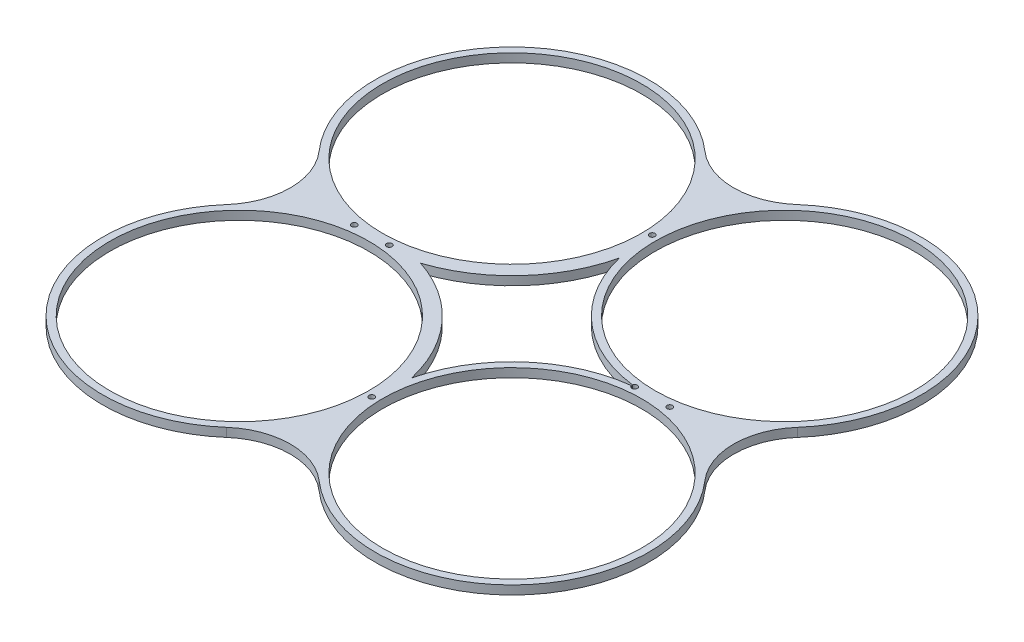
ISO-10303-21;
HEADER;
FILE_DESCRIPTION(('STEP AP214'),'2;1');
FILE_NAME('part.step','',(''),(''),'','','');
FILE_SCHEMA(('AUTOMOTIVE_DESIGN { 1 0 10303 214 1 1 1 1 }'));
ENDSEC;
DATA;
#1=APPLICATION_CONTEXT('core data for automotive mechanical design processes');
#2=APPLICATION_PROTOCOL_DEFINITION('international standard','automotive_design',2000,#1);
#3=PRODUCT_CONTEXT('',#1,'mechanical');
#4=PRODUCT('Part','Part','',(#3));
#5=PRODUCT_RELATED_PRODUCT_CATEGORY('part','',(#4));
#6=PRODUCT_DEFINITION_FORMATION('','',#4);
#7=PRODUCT_DEFINITION_CONTEXT('part definition',#1,'design');
#8=PRODUCT_DEFINITION('design','',#6,#7);
#9=PRODUCT_DEFINITION_SHAPE('','',#8);
#10=(LENGTH_UNIT() NAMED_UNIT(*) SI_UNIT(.MILLI.,.METRE.));
#11=(NAMED_UNIT(*) PLANE_ANGLE_UNIT() SI_UNIT($,.RADIAN.));
#12=(NAMED_UNIT(*) SI_UNIT($,.STERADIAN.) SOLID_ANGLE_UNIT());
#13=UNCERTAINTY_MEASURE_WITH_UNIT(LENGTH_MEASURE(1.E-05),#10,'distance_accuracy_value','');
#14=(GEOMETRIC_REPRESENTATION_CONTEXT(3) GLOBAL_UNCERTAINTY_ASSIGNED_CONTEXT((#13)) GLOBAL_UNIT_ASSIGNED_CONTEXT((#10,
#11,#12)) REPRESENTATION_CONTEXT('',''));
#15=CARTESIAN_POINT('',(0.,0.,0.));
#16=DIRECTION('',(0.,0.,1.));
#17=DIRECTION('',(1.,0.,0.));
#18=AXIS2_PLACEMENT_3D('',#15,#16,#17);
#19=CARTESIAN_POINT('',(70.,5.,0.));
#20=DIRECTION('',(0.,-1.,0.));
#21=DIRECTION('',(0.,0.,-1.));
#22=AXIS2_PLACEMENT_3D('',#19,#20,#21);
#23=CYLINDRICAL_SURFACE('',#22,1.60000000000001);
#24=CARTESIAN_POINT('',(70.,0.,0.));
#25=DIRECTION('',(0.,1.,0.));
#26=DIRECTION('',(0.,0.,1.));
#27=AXIS2_PLACEMENT_3D('',#24,#25,#26);
#28=CIRCLE('',#27,1.60000000000001);
#29=CARTESIAN_POINT('',(71.5997702857477,0.,-0.0271114890448843));
#30=VERTEX_POINT('',#29);
#31=CARTESIAN_POINT('',(68.4373081703196,0.,-0.343502904572385));
#32=VERTEX_POINT('',#31);
#33=EDGE_CURVE('E243',#30,#32,#28,.T.);
#34=ORIENTED_EDGE('',*,*,#33,.F.);
#35=DIRECTION('',(0.,-1.,0.));
#36=VECTOR('',#35,1.);
#37=CARTESIAN_POINT('',(71.5997702857477,5.,-0.0271114890448843));
#38=LINE('',#37,#36);
#39=CARTESIAN_POINT('',(71.5997702857477,5.,-0.0271114890448843));
#40=VERTEX_POINT('',#39);
#41=EDGE_CURVE('E11',#40,#30,#38,.T.);
#42=ORIENTED_EDGE('',*,*,#41,.F.);
#43=CARTESIAN_POINT('',(70.,5.,0.));
#44=DIRECTION('',(0.,1.,0.));
#45=DIRECTION('',(0.,0.,1.));
#46=AXIS2_PLACEMENT_3D('',#43,#44,#45);
#47=CIRCLE('',#46,1.60000000000001);
#48=CARTESIAN_POINT('',(68.4373081703196,5.,-0.343502904572385));
#49=VERTEX_POINT('',#48);
#50=EDGE_CURVE('E297',#40,#49,#47,.T.);
#51=ORIENTED_EDGE('',*,*,#50,.T.);
#52=DIRECTION('',(0.,-1.,0.));
#53=VECTOR('',#52,1.);
#54=CARTESIAN_POINT('',(68.4373081703196,5.,-0.343502904572385));
#55=LINE('',#54,#53);
#56=EDGE_CURVE('E118',#49,#32,#55,.T.);
#57=ORIENTED_EDGE('',*,*,#56,.T.);
#58=EDGE_LOOP('',(#34,#42,#51,#57));
#59=FACE_BOUND('',#58,.T.);
#60=ADVANCED_FACE('F41',(#59),#23,.F.);
#61=CARTESIAN_POINT('',(77.7817459305203,5.,-77.7817459305202));
#62=DIRECTION('',(0.,-1.,0.));
#63=DIRECTION('',(0.,0.,-1.));
#64=AXIS2_PLACEMENT_3D('',#61,#62,#63);
#65=CYLINDRICAL_SURFACE('',#64,78.0000000000001);
#66=CARTESIAN_POINT('',(77.7817459305203,0.,-77.7817459305202));
#67=DIRECTION('',(0.,1.,0.));
#68=DIRECTION('',(0.,0.,1.));
#69=AXIS2_PLACEMENT_3D('',#66,#67,#68);
#70=CIRCLE('',#69,78.0000000000001);
#71=CARTESIAN_POINT('',(71.9507940356715,0.,-1.11022302462516E-13));
#72=VERTEX_POINT('',#71);
#73=EDGE_CURVE('E240',#30,#72,#70,.T.);
#74=ORIENTED_EDGE('',*,*,#73,.T.);
#75=DIRECTION('',(0.,-1.,0.));
#76=VECTOR('',#75,1.);
#77=CARTESIAN_POINT('',(71.9507940356715,5.,-1.11022302462516E-13));
#78=LINE('',#77,#76);
#79=CARTESIAN_POINT('',(71.9507940356715,5.,-1.11022302462516E-13));
#80=VERTEX_POINT('',#79);
#81=EDGE_CURVE('E51',#80,#72,#78,.T.);
#82=ORIENTED_EDGE('',*,*,#81,.F.);
#83=CARTESIAN_POINT('',(77.7817459305203,5.,-77.7817459305202));
#84=DIRECTION('',(0.,1.,0.));
#85=DIRECTION('',(0.,0.,1.));
#86=AXIS2_PLACEMENT_3D('',#83,#84,#85);
#87=CIRCLE('',#86,78.0000000000001);
#88=EDGE_CURVE('E294',#40,#80,#87,.T.);
#89=ORIENTED_EDGE('',*,*,#88,.F.);
#90=ORIENTED_EDGE('',*,*,#41,.T.);
#91=EDGE_LOOP('',(#74,#82,#89,#90));
#92=FACE_BOUND('',#91,.T.);
#93=ADVANCED_FACE('F376',(#92),#65,.T.);
#94=CARTESIAN_POINT('',(77.7817459305203,5.,77.7817459305203));
#95=DIRECTION('',(0.,-1.,0.));
#96=DIRECTION('',(0.,0.,-1.));
#97=AXIS2_PLACEMENT_3D('',#94,#95,#96);
#98=CYLINDRICAL_SURFACE('',#97,78.0000000000002);
#99=CARTESIAN_POINT('',(77.7817459305203,0.,77.7817459305203));
#100=DIRECTION('',(0.,1.,0.));
#101=DIRECTION('',(0.,0.,1.));
#102=AXIS2_PLACEMENT_3D('',#99,#100,#101);
#103=CIRCLE('',#102,78.0000000000002);
#104=CARTESIAN_POINT('',(71.5997702857477,0.,0.0271114890448843));
#105=VERTEX_POINT('',#104);
#106=EDGE_CURVE('E236',#72,#105,#103,.T.);
#107=ORIENTED_EDGE('',*,*,#106,.T.);
#108=DIRECTION('',(0.,-1.,0.));
#109=VECTOR('',#108,1.);
#110=CARTESIAN_POINT('',(71.5997702857477,5.,0.0271114890448843));
#111=LINE('',#110,#109);
#112=CARTESIAN_POINT('',(71.5997702857477,5.,0.0271114890448843));
#113=VERTEX_POINT('',#112);
#114=EDGE_CURVE('E196',#113,#105,#111,.T.);
#115=ORIENTED_EDGE('',*,*,#114,.F.);
#116=CARTESIAN_POINT('',(77.7817459305203,5.,77.7817459305203));
#117=DIRECTION('',(0.,1.,0.));
#118=DIRECTION('',(0.,0.,1.));
#119=AXIS2_PLACEMENT_3D('',#116,#117,#118);
#120=CIRCLE('',#119,78.0000000000002);
#121=EDGE_CURVE('E291',#80,#113,#120,.T.);
#122=ORIENTED_EDGE('',*,*,#121,.F.);
#123=ORIENTED_EDGE('',*,*,#81,.T.);
#124=EDGE_LOOP('',(#107,#115,#122,#123));
#125=FACE_BOUND('',#124,.T.);
#126=ADVANCED_FACE('F382',(#125),#98,.T.);
#127=CARTESIAN_POINT('',(68.4373081703196,0.,0.343502904572385));
#128=VERTEX_POINT('',#127);
#129=EDGE_CURVE('E239',#128,#105,#28,.T.);
#130=ORIENTED_EDGE('',*,*,#129,.F.);
#131=DIRECTION('',(0.,-1.,0.));
#132=VECTOR('',#131,1.);
#133=CARTESIAN_POINT('',(68.4373081703196,5.,0.343502904572385));
#134=LINE('',#133,#132);
#135=CARTESIAN_POINT('',(68.4373081703196,5.,0.343502904572385));
#136=VERTEX_POINT('',#135);
#137=EDGE_CURVE('E190',#136,#128,#134,.T.);
#138=ORIENTED_EDGE('',*,*,#137,.F.);
#139=EDGE_CURVE('E293',#136,#113,#47,.T.);
#140=ORIENTED_EDGE('',*,*,#139,.T.);
#141=ORIENTED_EDGE('',*,*,#114,.T.);
#142=EDGE_LOOP('',(#130,#138,#140,#141));
#143=FACE_BOUND('',#142,.T.);
#144=ADVANCED_FACE('F378',(#143),#23,.F.);
#145=CARTESIAN_POINT('',(2.0043584537079,0.,59.2942488801065));
#146=VERTEX_POINT('',#145);
#147=EDGE_CURVE('E235',#128,#146,#103,.T.);
#148=ORIENTED_EDGE('',*,*,#147,.T.);
#149=DIRECTION('',(0.,-1.,0.));
#150=VECTOR('',#149,1.);
#151=CARTESIAN_POINT('',(2.0043584537079,5.,59.2942488801065));
#152=LINE('',#151,#150);
#153=CARTESIAN_POINT('',(2.0043584537079,5.,59.2942488801065));
#154=VERTEX_POINT('',#153);
#155=EDGE_CURVE('E188',#154,#146,#152,.T.);
#156=ORIENTED_EDGE('',*,*,#155,.F.);
#157=EDGE_CURVE('E181',#136,#154,#120,.T.);
#158=ORIENTED_EDGE('',*,*,#157,.F.);
#159=ORIENTED_EDGE('',*,*,#137,.T.);
#160=EDGE_LOOP('',(#148,#156,#158,#159));
#161=FACE_BOUND('',#160,.T.);
#162=ADVANCED_FACE('F389',(#161),#98,.T.);
#163=CARTESIAN_POINT('',(-77.7817459305202,5.,77.7817459305203));
#164=DIRECTION('',(0.,-1.,0.));
#165=DIRECTION('',(0.,0.,-1.));
#166=AXIS2_PLACEMENT_3D('',#163,#164,#165);
#167=CYLINDRICAL_SURFACE('',#166,81.9);
#168=CARTESIAN_POINT('',(-77.7817459305202,0.,77.7817459305203));
#169=DIRECTION('',(0.,1.,0.));
#170=DIRECTION('',(0.,0.,1.));
#171=AXIS2_PLACEMENT_3D('',#168,#169,#170);
#172=CIRCLE('',#171,81.9);
#173=CARTESIAN_POINT('',(-52.1378382719749,0.,0.));
#174=VERTEX_POINT('',#173);
#175=EDGE_CURVE('E187',#146,#174,#172,.T.);
#176=ORIENTED_EDGE('',*,*,#175,.T.);
#177=DIRECTION('',(0.,-1.,0.));
#178=VECTOR('',#177,1.);
#179=CARTESIAN_POINT('',(-52.1378382719749,5.,0.));
#180=LINE('',#179,#178);
#181=CARTESIAN_POINT('',(-52.1378382719749,5.,0.));
#182=VERTEX_POINT('',#181);
#183=EDGE_CURVE('E171',#182,#174,#180,.T.);
#184=ORIENTED_EDGE('',*,*,#183,.F.);
#185=CARTESIAN_POINT('',(-77.7817459305202,5.,77.7817459305203));
#186=DIRECTION('',(0.,1.,0.));
#187=DIRECTION('',(0.,0.,1.));
#188=AXIS2_PLACEMENT_3D('',#185,#186,#187);
#189=CIRCLE('',#188,81.9);
#190=EDGE_CURVE('E174',#154,#182,#189,.T.);
#191=ORIENTED_EDGE('',*,*,#190,.F.);
#192=ORIENTED_EDGE('',*,*,#155,.T.);
#193=EDGE_LOOP('',(#176,#184,#191,#192));
#194=FACE_BOUND('',#193,.T.);
#195=ADVANCED_FACE('F186',(#194),#167,.T.);
#196=CARTESIAN_POINT('',(-77.7817459305202,5.,-77.7817459305202));
#197=DIRECTION('',(0.,-1.,0.));
#198=DIRECTION('',(0.,0.,-1.));
#199=AXIS2_PLACEMENT_3D('',#196,#197,#198);
#200=CYLINDRICAL_SURFACE('',#199,81.8999999999999);
#201=CARTESIAN_POINT('',(-77.7817459305202,0.,-77.7817459305202));
#202=DIRECTION('',(0.,1.,0.));
#203=DIRECTION('',(0.,0.,1.));
#204=AXIS2_PLACEMENT_3D('',#201,#202,#203);
#205=CIRCLE('',#204,81.8999999999999);
#206=CARTESIAN_POINT('',(2.00435845370781,0.,-59.2942488801068));
#207=VERTEX_POINT('',#206);
#208=EDGE_CURVE('E232',#174,#207,#205,.T.);
#209=ORIENTED_EDGE('',*,*,#208,.T.);
#210=DIRECTION('',(0.,-1.,0.));
#211=VECTOR('',#210,1.);
#212=CARTESIAN_POINT('',(2.00435845370781,5.,-59.2942488801068));
#213=LINE('',#212,#211);
#214=CARTESIAN_POINT('',(2.00435845370781,5.,-59.2942488801068));
#215=VERTEX_POINT('',#214);
#216=EDGE_CURVE('E173',#215,#207,#213,.T.);
#217=ORIENTED_EDGE('',*,*,#216,.F.);
#218=CARTESIAN_POINT('',(-77.7817459305202,5.,-77.7817459305202));
#219=DIRECTION('',(0.,1.,0.));
#220=DIRECTION('',(0.,0.,1.));
#221=AXIS2_PLACEMENT_3D('',#218,#219,#220);
#222=CIRCLE('',#221,81.8999999999999);
#223=EDGE_CURVE('E166',#182,#215,#222,.T.);
#224=ORIENTED_EDGE('',*,*,#223,.F.);
#225=ORIENTED_EDGE('',*,*,#183,.T.);
#226=EDGE_LOOP('',(#209,#217,#224,#225));
#227=FACE_BOUND('',#226,.T.);
#228=ADVANCED_FACE('F169',(#227),#200,.T.);
#229=CARTESIAN_POINT('',(-166.517308136436,5.,0.));
#230=DIRECTION('',(0.,-1.,0.));
#231=DIRECTION('',(0.,0.,-1.));
#232=AXIS2_PLACEMENT_3D('',#229,#230,#231);
#233=CYLINDRICAL_SURFACE('',#232,40.);
#234=CARTESIAN_POINT('',(-166.517308136436,0.,0.));
#235=DIRECTION('',(0.,1.,0.));
#236=DIRECTION('',(0.,0.,1.));
#237=AXIS2_PLACEMENT_3D('',#234,#235,#236);
#238=CIRCLE('',#237,40.);
#239=CARTESIAN_POINT('',(-136.437456541211,0.,-26.3666935357696));
#240=VERTEX_POINT('',#239);
#241=CARTESIAN_POINT('',(-136.437456541211,0.,26.3666935357696));
#242=VERTEX_POINT('',#241);
#243=EDGE_CURVE('E275',#240,#242,#238,.F.);
#244=ORIENTED_EDGE('',*,*,#243,.T.);
#245=DIRECTION('',(0.,-1.,0.));
#246=VECTOR('',#245,1.);
#247=CARTESIAN_POINT('',(-136.437456541211,5.,26.3666935357696));
#248=LINE('',#247,#246);
#249=CARTESIAN_POINT('',(-136.437456541211,5.,26.3666935357696));
#250=VERTEX_POINT('',#249);
#251=EDGE_CURVE('E45',#250,#242,#248,.T.);
#252=ORIENTED_EDGE('',*,*,#251,.F.);
#253=CARTESIAN_POINT('',(-166.517308136436,5.,0.));
#254=DIRECTION('',(0.,1.,0.));
#255=DIRECTION('',(0.,0.,1.));
#256=AXIS2_PLACEMENT_3D('',#253,#254,#255);
#257=CIRCLE('',#256,40.);
#258=CARTESIAN_POINT('',(-136.437456541211,5.,-26.3666935357696));
#259=VERTEX_POINT('',#258);
#260=EDGE_CURVE('E326',#259,#250,#257,.F.);
#261=ORIENTED_EDGE('',*,*,#260,.F.);
#262=DIRECTION('',(0.,-1.,0.));
#263=VECTOR('',#262,1.);
#264=CARTESIAN_POINT('',(-136.437456541211,5.,-26.3666935357696));
#265=LINE('',#264,#263);
#266=EDGE_CURVE('E200',#259,#240,#265,.T.);
#267=ORIENTED_EDGE('',*,*,#266,.T.);
#268=EDGE_LOOP('',(#244,#252,#261,#267));
#269=FACE_BOUND('',#268,.T.);
#270=ADVANCED_FACE('F411',(#269),#233,.F.);
#271=CARTESIAN_POINT('',(-77.7817459305202,5.,77.7817459305203));
#272=DIRECTION('',(0.,-1.,0.));
#273=DIRECTION('',(0.,0.,-1.));
#274=AXIS2_PLACEMENT_3D('',#271,#272,#273);
#275=CYLINDRICAL_SURFACE('',#274,78.);
#276=CARTESIAN_POINT('',(-77.7817459305202,0.,77.7817459305203));
#277=DIRECTION('',(0.,1.,0.));
#278=DIRECTION('',(0.,0.,1.));
#279=AXIS2_PLACEMENT_3D('',#276,#277,#278);
#280=CIRCLE('',#279,78.);
#281=CARTESIAN_POINT('',(-26.3666935357695,0.,136.43745654121));
#282=VERTEX_POINT('',#281);
#283=EDGE_CURVE('E273',#242,#282,#280,.T.);
#284=ORIENTED_EDGE('',*,*,#283,.T.);
#285=DIRECTION('',(0.,-1.,0.));
#286=VECTOR('',#285,1.);
#287=CARTESIAN_POINT('',(-26.3666935357695,5.,136.43745654121));
#288=LINE('',#287,#286);
#289=CARTESIAN_POINT('',(-26.3666935357695,5.,136.43745654121));
#290=VERTEX_POINT('',#289);
#291=EDGE_CURVE('E214',#290,#282,#288,.T.);
#292=ORIENTED_EDGE('',*,*,#291,.F.);
#293=CARTESIAN_POINT('',(-77.7817459305202,5.,77.7817459305203));
#294=DIRECTION('',(0.,1.,0.));
#295=DIRECTION('',(0.,0.,1.));
#296=AXIS2_PLACEMENT_3D('',#293,#294,#295);
#297=CIRCLE('',#296,78.);
#298=EDGE_CURVE('E126',#250,#290,#297,.T.);
#299=ORIENTED_EDGE('',*,*,#298,.F.);
#300=ORIENTED_EDGE('',*,*,#251,.T.);
#301=EDGE_LOOP('',(#284,#292,#299,#300));
#302=FACE_BOUND('',#301,.T.);
#303=ADVANCED_FACE('F454',(#302),#275,.T.);
#304=CARTESIAN_POINT('',(0.,5.,166.517308136436));
#305=DIRECTION('',(0.,-1.,0.));
#306=DIRECTION('',(0.,0.,-1.));
#307=AXIS2_PLACEMENT_3D('',#304,#305,#306);
#308=CYLINDRICAL_SURFACE('',#307,40.);
#309=CARTESIAN_POINT('',(0.,0.,166.517308136436));
#310=DIRECTION('',(0.,1.,0.));
#311=DIRECTION('',(0.,0.,1.));
#312=AXIS2_PLACEMENT_3D('',#309,#310,#311);
#313=CIRCLE('',#312,40.);
#314=CARTESIAN_POINT('',(26.3666935357696,0.,136.43745654121));
#315=VERTEX_POINT('',#314);
#316=EDGE_CURVE('E271',#282,#315,#313,.F.);
#317=ORIENTED_EDGE('',*,*,#316,.T.);
#318=DIRECTION('',(0.,-1.,0.));
#319=VECTOR('',#318,1.);
#320=CARTESIAN_POINT('',(26.3666935357696,5.,136.43745654121));
#321=LINE('',#320,#319);
#322=CARTESIAN_POINT('',(26.3666935357696,5.,136.43745654121));
#323=VERTEX_POINT('',#322);
#324=EDGE_CURVE('E212',#323,#315,#321,.T.);
#325=ORIENTED_EDGE('',*,*,#324,.F.);
#326=CARTESIAN_POINT('',(0.,5.,166.517308136436));
#327=DIRECTION('',(0.,1.,0.));
#328=DIRECTION('',(0.,0.,1.));
#329=AXIS2_PLACEMENT_3D('',#326,#327,#328);
#330=CIRCLE('',#329,40.);
#331=EDGE_CURVE('E323',#290,#323,#330,.F.);
#332=ORIENTED_EDGE('',*,*,#331,.F.);
#333=ORIENTED_EDGE('',*,*,#291,.T.);
#334=EDGE_LOOP('',(#317,#325,#332,#333));
#335=FACE_BOUND('',#334,.T.);
#336=ADVANCED_FACE('F450',(#335),#308,.F.);
#337=CARTESIAN_POINT('',(77.7817459305203,5.,77.7817459305203));
#338=DIRECTION('',(0.,-1.,0.));
#339=DIRECTION('',(0.,0.,-1.));
#340=AXIS2_PLACEMENT_3D('',#337,#338,#339);
#341=CYLINDRICAL_SURFACE('',#340,77.9999999999999);
#342=CARTESIAN_POINT('',(77.7817459305203,0.,77.7817459305203));
#343=DIRECTION('',(0.,1.,0.));
#344=DIRECTION('',(0.,0.,1.));
#345=AXIS2_PLACEMENT_3D('',#342,#343,#344);
#346=CIRCLE('',#345,77.9999999999999);
#347=CARTESIAN_POINT('',(136.437456541211,0.,26.3666935357697));
#348=VERTEX_POINT('',#347);
#349=EDGE_CURVE('E268',#315,#348,#346,.T.);
#350=ORIENTED_EDGE('',*,*,#349,.T.);
#351=DIRECTION('',(0.,-1.,0.));
#352=VECTOR('',#351,1.);
#353=CARTESIAN_POINT('',(136.437456541211,5.,26.3666935357697));
#354=LINE('',#353,#352);
#355=CARTESIAN_POINT('',(136.437456541211,5.,26.3666935357697));
#356=VERTEX_POINT('',#355);
#357=EDGE_CURVE('E210',#356,#348,#354,.T.);
#358=ORIENTED_EDGE('',*,*,#357,.F.);
#359=CARTESIAN_POINT('',(77.7817459305203,5.,77.7817459305203));
#360=DIRECTION('',(0.,1.,0.));
#361=DIRECTION('',(0.,0.,1.));
#362=AXIS2_PLACEMENT_3D('',#359,#360,#361);
#363=CIRCLE('',#362,77.9999999999999);
#364=EDGE_CURVE('E321',#323,#356,#363,.T.);
#365=ORIENTED_EDGE('',*,*,#364,.F.);
#366=ORIENTED_EDGE('',*,*,#324,.T.);
#367=EDGE_LOOP('',(#350,#358,#365,#366));
#368=FACE_BOUND('',#367,.T.);
#369=ADVANCED_FACE('F446',(#368),#341,.T.);
#370=CARTESIAN_POINT('',(166.517308136436,5.,0.));
#371=DIRECTION('',(0.,-1.,0.));
#372=DIRECTION('',(0.,0.,-1.));
#373=AXIS2_PLACEMENT_3D('',#370,#371,#372);
#374=CYLINDRICAL_SURFACE('',#373,40.);
#375=CARTESIAN_POINT('',(166.517308136436,0.,0.));
#376=DIRECTION('',(0.,1.,0.));
#377=DIRECTION('',(0.,0.,1.));
#378=AXIS2_PLACEMENT_3D('',#375,#376,#377);
#379=CIRCLE('',#378,40.);
#380=CARTESIAN_POINT('',(136.437456541211,0.,-26.3666935357696));
#381=VERTEX_POINT('',#380);
#382=EDGE_CURVE('E265',#381,#348,#379,.T.);
#383=ORIENTED_EDGE('',*,*,#382,.F.);
#384=DIRECTION('',(0.,-1.,0.));
#385=VECTOR('',#384,1.);
#386=CARTESIAN_POINT('',(136.437456541211,5.,-26.3666935357696));
#387=LINE('',#386,#385);
#388=CARTESIAN_POINT('',(136.437456541211,5.,-26.3666935357696));
#389=VERTEX_POINT('',#388);
#390=EDGE_CURVE('E208',#389,#381,#387,.T.);
#391=ORIENTED_EDGE('',*,*,#390,.F.);
#392=CARTESIAN_POINT('',(166.517308136436,5.,0.));
#393=DIRECTION('',(0.,1.,0.));
#394=DIRECTION('',(0.,0.,1.));
#395=AXIS2_PLACEMENT_3D('',#392,#393,#394);
#396=CIRCLE('',#395,40.);
#397=EDGE_CURVE('E318',#389,#356,#396,.T.);
#398=ORIENTED_EDGE('',*,*,#397,.T.);
#399=ORIENTED_EDGE('',*,*,#357,.T.);
#400=EDGE_LOOP('',(#383,#391,#398,#399));
#401=FACE_BOUND('',#400,.T.);
#402=ADVANCED_FACE('F436',(#401),#374,.F.);
#403=CARTESIAN_POINT('',(77.7817459305203,5.,-77.7817459305202));
#404=DIRECTION('',(0.,-1.,0.));
#405=DIRECTION('',(0.,0.,-1.));
#406=AXIS2_PLACEMENT_3D('',#403,#404,#405);
#407=CYLINDRICAL_SURFACE('',#406,78.);
#408=CARTESIAN_POINT('',(77.7817459305203,0.,-77.7817459305202));
#409=DIRECTION('',(0.,1.,0.));
#410=DIRECTION('',(0.,0.,1.));
#411=AXIS2_PLACEMENT_3D('',#408,#409,#410);
#412=CIRCLE('',#411,78.);
#413=CARTESIAN_POINT('',(26.3666935357696,0.,-136.43745654121));
#414=VERTEX_POINT('',#413);
#415=EDGE_CURVE('E262',#381,#414,#412,.T.);
#416=ORIENTED_EDGE('',*,*,#415,.T.);
#417=DIRECTION('',(0.,-1.,0.));
#418=VECTOR('',#417,1.);
#419=CARTESIAN_POINT('',(26.3666935357696,5.,-136.43745654121));
#420=LINE('',#419,#418);
#421=CARTESIAN_POINT('',(26.3666935357696,5.,-136.43745654121));
#422=VERTEX_POINT('',#421);
#423=EDGE_CURVE('E206',#422,#414,#420,.T.);
#424=ORIENTED_EDGE('',*,*,#423,.F.);
#425=CARTESIAN_POINT('',(77.7817459305203,5.,-77.7817459305202));
#426=DIRECTION('',(0.,1.,0.));
#427=DIRECTION('',(0.,0.,1.));
#428=AXIS2_PLACEMENT_3D('',#425,#426,#427);
#429=CIRCLE('',#428,78.);
#430=EDGE_CURVE('E316',#389,#422,#429,.T.);
#431=ORIENTED_EDGE('',*,*,#430,.F.);
#432=ORIENTED_EDGE('',*,*,#390,.T.);
#433=EDGE_LOOP('',(#416,#424,#431,#432));
#434=FACE_BOUND('',#433,.T.);
#435=ADVANCED_FACE('F426',(#434),#407,.T.);
#436=CARTESIAN_POINT('',(0.,5.,-166.517308136436));
#437=DIRECTION('',(0.,-1.,0.));
#438=DIRECTION('',(0.,0.,-1.));
#439=AXIS2_PLACEMENT_3D('',#436,#437,#438);
#440=CYLINDRICAL_SURFACE('',#439,40.);
#441=CARTESIAN_POINT('',(0.,0.,-166.517308136436));
#442=DIRECTION('',(0.,1.,0.));
#443=DIRECTION('',(0.,0.,1.));
#444=AXIS2_PLACEMENT_3D('',#441,#442,#443);
#445=CIRCLE('',#444,40.);
#446=CARTESIAN_POINT('',(-26.3666935357695,0.,-136.43745654121));
#447=VERTEX_POINT('',#446);
#448=EDGE_CURVE('E259',#447,#414,#445,.T.);
#449=ORIENTED_EDGE('',*,*,#448,.F.);
#450=DIRECTION('',(0.,-1.,0.));
#451=VECTOR('',#450,1.);
#452=CARTESIAN_POINT('',(-26.3666935357695,5.,-136.43745654121));
#453=LINE('',#452,#451);
#454=CARTESIAN_POINT('',(-26.3666935357695,5.,-136.43745654121));
#455=VERTEX_POINT('',#454);
#456=EDGE_CURVE('E203',#455,#447,#453,.T.);
#457=ORIENTED_EDGE('',*,*,#456,.F.);
#458=CARTESIAN_POINT('',(0.,5.,-166.517308136436));
#459=DIRECTION('',(0.,1.,0.));
#460=DIRECTION('',(0.,0.,1.));
#461=AXIS2_PLACEMENT_3D('',#458,#459,#460);
#462=CIRCLE('',#461,40.);
#463=EDGE_CURVE('E313',#455,#422,#462,.T.);
#464=ORIENTED_EDGE('',*,*,#463,.T.);
#465=ORIENTED_EDGE('',*,*,#423,.T.);
#466=EDGE_LOOP('',(#449,#457,#464,#465));
#467=FACE_BOUND('',#466,.T.);
#468=ADVANCED_FACE('F421',(#467),#440,.F.);
#469=CARTESIAN_POINT('',(0.,5.,80.));
#470=DIRECTION('',(0.,-1.,0.));
#471=DIRECTION('',(0.,0.,-1.));
#472=AXIS2_PLACEMENT_3D('',#469,#470,#471);
#473=CYLINDRICAL_SURFACE('',#472,1.6);
#474=CARTESIAN_POINT('',(0.,5.,80.));
#475=DIRECTION('',(0.,1.,0.));
#476=DIRECTION('',(0.,0.,1.));
#477=AXIS2_PLACEMENT_3D('',#474,#475,#476);
#478=CIRCLE('',#477,1.6);
#479=CARTESIAN_POINT('',(0.,5.,81.6));
#480=VERTEX_POINT('',#479);
#481=EDGE_CURVE('E285',#480,#480,#478,.T.);
#482=ORIENTED_EDGE('',*,*,#481,.T.);
#483=EDGE_LOOP('',(#482));
#484=FACE_BOUND('',#483,.T.);
#485=CARTESIAN_POINT('',(0.,0.,80.));
#486=DIRECTION('',(0.,1.,0.));
#487=DIRECTION('',(0.,0.,1.));
#488=AXIS2_PLACEMENT_3D('',#485,#486,#487);
#489=CIRCLE('',#488,1.6);
#490=CARTESIAN_POINT('',(0.,0.,81.6));
#491=VERTEX_POINT('',#490);
#492=EDGE_CURVE('E226',#491,#491,#489,.T.);
#493=ORIENTED_EDGE('',*,*,#492,.F.);
#494=EDGE_LOOP('',(#493));
#495=FACE_BOUND('',#494,.T.);
#496=ADVANCED_FACE('F418',(#484,#495),#473,.F.);
#497=CARTESIAN_POINT('',(-70.,5.,0.));
#498=DIRECTION('',(0.,-1.,0.));
#499=DIRECTION('',(0.,0.,-1.));
#500=AXIS2_PLACEMENT_3D('',#497,#498,#499);
#501=CYLINDRICAL_SURFACE('',#500,1.60000000000001);
#502=CARTESIAN_POINT('',(-70.,5.,0.));
#503=DIRECTION('',(0.,1.,0.));
#504=DIRECTION('',(0.,0.,1.));
#505=AXIS2_PLACEMENT_3D('',#502,#503,#504);
#506=CIRCLE('',#505,1.60000000000001);
#507=CARTESIAN_POINT('',(-70.,5.,1.60000000000001));
#508=VERTEX_POINT('',#507);
#509=EDGE_CURVE('E288',#508,#508,#506,.F.);
#510=ORIENTED_EDGE('',*,*,#509,.F.);
#511=EDGE_LOOP('',(#510));
#512=FACE_BOUND('',#511,.T.);
#513=CARTESIAN_POINT('',(-70.,0.,0.));
#514=DIRECTION('',(0.,1.,0.));
#515=DIRECTION('',(0.,0.,1.));
#516=AXIS2_PLACEMENT_3D('',#513,#514,#515);
#517=CIRCLE('',#516,1.60000000000001);
#518=CARTESIAN_POINT('',(-70.,0.,1.60000000000001));
#519=VERTEX_POINT('',#518);
#520=EDGE_CURVE('E229',#519,#519,#517,.F.);
#521=ORIENTED_EDGE('',*,*,#520,.T.);
#522=EDGE_LOOP('',(#521));
#523=FACE_BOUND('',#522,.T.);
#524=ADVANCED_FACE('F415',(#512,#523),#501,.F.);
#525=EDGE_CURVE('E111',#207,#32,#70,.T.);
#526=ORIENTED_EDGE('',*,*,#525,.T.);
#527=ORIENTED_EDGE('',*,*,#56,.F.);
#528=EDGE_CURVE('E60',#215,#49,#87,.T.);
#529=ORIENTED_EDGE('',*,*,#528,.F.);
#530=ORIENTED_EDGE('',*,*,#216,.T.);
#531=EDGE_LOOP('',(#526,#527,#529,#530));
#532=FACE_BOUND('',#531,.T.);
#533=ADVANCED_FACE('F385',(#532),#65,.T.);
#534=CARTESIAN_POINT('',(77.7817459305203,5.,-77.7817459305202));
#535=DIRECTION('',(0.,-1.,0.));
#536=DIRECTION('',(0.,0.,-1.));
#537=AXIS2_PLACEMENT_3D('',#534,#535,#536);
#538=CYLINDRICAL_SURFACE('',#537,73.9);
#539=CARTESIAN_POINT('',(77.7817459305203,5.,-77.7817459305202));
#540=DIRECTION('',(0.,1.,0.));
#541=DIRECTION('',(0.,0.,1.));
#542=AXIS2_PLACEMENT_3D('',#539,#540,#541);
#543=CIRCLE('',#542,73.9);
#544=CARTESIAN_POINT('',(77.7817459305203,5.,-3.88174593052021));
#545=VERTEX_POINT('',#544);
#546=EDGE_CURVE('E299',#545,#545,#543,.T.);
#547=ORIENTED_EDGE('',*,*,#546,.T.);
#548=EDGE_LOOP('',(#547));
#549=FACE_BOUND('',#548,.T.);
#550=CARTESIAN_POINT('',(77.7817459305203,0.,-77.7817459305202));
#551=DIRECTION('',(0.,1.,0.));
#552=DIRECTION('',(0.,0.,1.));
#553=AXIS2_PLACEMENT_3D('',#550,#551,#552);
#554=CIRCLE('',#553,73.9);
#555=CARTESIAN_POINT('',(77.7817459305203,0.,-3.88174593052021));
#556=VERTEX_POINT('',#555);
#557=EDGE_CURVE('E245',#556,#556,#554,.T.);
#558=ORIENTED_EDGE('',*,*,#557,.F.);
#559=EDGE_LOOP('',(#558));
#560=FACE_BOUND('',#559,.T.);
#561=ADVANCED_FACE('F414',(#549,#560),#538,.F.);
#562=CARTESIAN_POINT('',(-77.7817459305202,5.,-77.7817459305202));
#563=DIRECTION('',(0.,-1.,0.));
#564=DIRECTION('',(0.,0.,-1.));
#565=AXIS2_PLACEMENT_3D('',#562,#563,#564);
#566=CYLINDRICAL_SURFACE('',#565,73.9);
#567=CARTESIAN_POINT('',(-77.7817459305202,5.,-77.7817459305202));
#568=DIRECTION('',(0.,1.,0.));
#569=DIRECTION('',(0.,0.,1.));
#570=AXIS2_PLACEMENT_3D('',#567,#568,#569);
#571=CIRCLE('',#570,73.9);
#572=CARTESIAN_POINT('',(-77.7817459305202,5.,-3.88174593052021));
#573=VERTEX_POINT('',#572);
#574=EDGE_CURVE('E302',#573,#573,#571,.T.);
#575=ORIENTED_EDGE('',*,*,#574,.T.);
#576=EDGE_LOOP('',(#575));
#577=FACE_BOUND('',#576,.T.);
#578=CARTESIAN_POINT('',(-77.7817459305202,0.,-77.7817459305202));
#579=DIRECTION('',(0.,1.,0.));
#580=DIRECTION('',(0.,0.,1.));
#581=AXIS2_PLACEMENT_3D('',#578,#579,#580);
#582=CIRCLE('',#581,73.9);
#583=CARTESIAN_POINT('',(-77.7817459305202,0.,-3.88174593052021));
#584=VERTEX_POINT('',#583);
#585=EDGE_CURVE('E248',#584,#584,#582,.T.);
#586=ORIENTED_EDGE('',*,*,#585,.F.);
#587=EDGE_LOOP('',(#586));
#588=FACE_BOUND('',#587,.T.);
#589=ADVANCED_FACE('F481',(#577,#588),#566,.F.);
#590=CARTESIAN_POINT('',(-77.7817459305202,5.,77.7817459305203));
#591=DIRECTION('',(0.,-1.,0.));
#592=DIRECTION('',(0.,0.,-1.));
#593=AXIS2_PLACEMENT_3D('',#590,#591,#592);
#594=CYLINDRICAL_SURFACE('',#593,73.9);
#595=CARTESIAN_POINT('',(-77.7817459305202,5.,77.7817459305203));
#596=DIRECTION('',(0.,1.,0.));
#597=DIRECTION('',(0.,0.,1.));
#598=AXIS2_PLACEMENT_3D('',#595,#596,#597);
#599=CIRCLE('',#598,73.9);
#600=CARTESIAN_POINT('',(-77.7817459305202,5.,151.68174593052));
#601=VERTEX_POINT('',#600);
#602=EDGE_CURVE('E305',#601,#601,#599,.T.);
#603=ORIENTED_EDGE('',*,*,#602,.T.);
#604=EDGE_LOOP('',(#603));
#605=FACE_BOUND('',#604,.T.);
#606=CARTESIAN_POINT('',(-77.7817459305202,0.,77.7817459305203));
#607=DIRECTION('',(0.,1.,0.));
#608=DIRECTION('',(0.,0.,1.));
#609=AXIS2_PLACEMENT_3D('',#606,#607,#608);
#610=CIRCLE('',#609,73.9);
#611=CARTESIAN_POINT('',(-77.7817459305202,0.,151.68174593052));
#612=VERTEX_POINT('',#611);
#613=EDGE_CURVE('E251',#612,#612,#610,.T.);
#614=ORIENTED_EDGE('',*,*,#613,.F.);
#615=EDGE_LOOP('',(#614));
#616=FACE_BOUND('',#615,.T.);
#617=ADVANCED_FACE('F485',(#605,#616),#594,.F.);
#618=CARTESIAN_POINT('',(77.7817459305203,5.,77.7817459305203));
#619=DIRECTION('',(0.,-1.,0.));
#620=DIRECTION('',(0.,0.,-1.));
#621=AXIS2_PLACEMENT_3D('',#618,#619,#620);
#622=CYLINDRICAL_SURFACE('',#621,73.9);
#623=CARTESIAN_POINT('',(77.7817459305203,5.,77.7817459305203));
#624=DIRECTION('',(0.,1.,0.));
#625=DIRECTION('',(0.,0.,1.));
#626=AXIS2_PLACEMENT_3D('',#623,#624,#625);
#627=CIRCLE('',#626,73.9);
#628=CARTESIAN_POINT('',(77.7817459305203,5.,151.68174593052));
#629=VERTEX_POINT('',#628);
#630=EDGE_CURVE('E308',#629,#629,#627,.T.);
#631=ORIENTED_EDGE('',*,*,#630,.T.);
#632=EDGE_LOOP('',(#631));
#633=FACE_BOUND('',#632,.T.);
#634=CARTESIAN_POINT('',(77.7817459305203,0.,77.7817459305203));
#635=DIRECTION('',(0.,1.,0.));
#636=DIRECTION('',(0.,0.,1.));
#637=AXIS2_PLACEMENT_3D('',#634,#635,#636);
#638=CIRCLE('',#637,73.9);
#639=CARTESIAN_POINT('',(77.7817459305203,0.,151.68174593052));
#640=VERTEX_POINT('',#639);
#641=EDGE_CURVE('E254',#640,#640,#638,.T.);
#642=ORIENTED_EDGE('',*,*,#641,.F.);
#643=EDGE_LOOP('',(#642));
#644=FACE_BOUND('',#643,.T.);
#645=ADVANCED_FACE('F464',(#633,#644),#622,.F.);
#646=CARTESIAN_POINT('',(-77.7817459305202,5.,-77.7817459305202));
#647=DIRECTION('',(0.,-1.,0.));
#648=DIRECTION('',(0.,0.,-1.));
#649=AXIS2_PLACEMENT_3D('',#646,#647,#648);
#650=CYLINDRICAL_SURFACE('',#649,78.);
#651=CARTESIAN_POINT('',(-77.7817459305202,0.,-77.7817459305202));
#652=DIRECTION('',(0.,1.,0.));
#653=DIRECTION('',(0.,0.,1.));
#654=AXIS2_PLACEMENT_3D('',#651,#652,#653);
#655=CIRCLE('',#654,78.);
#656=EDGE_CURVE('E257',#447,#240,#655,.T.);
#657=ORIENTED_EDGE('',*,*,#656,.T.);
#658=ORIENTED_EDGE('',*,*,#266,.F.);
#659=CARTESIAN_POINT('',(-77.7817459305202,5.,-77.7817459305202));
#660=DIRECTION('',(0.,1.,0.));
#661=DIRECTION('',(0.,0.,1.));
#662=AXIS2_PLACEMENT_3D('',#659,#660,#661);
#663=CIRCLE('',#662,78.);
#664=EDGE_CURVE('E311',#455,#259,#663,.T.);
#665=ORIENTED_EDGE('',*,*,#664,.F.);
#666=ORIENTED_EDGE('',*,*,#456,.T.);
#667=EDGE_LOOP('',(#657,#658,#665,#666));
#668=FACE_BOUND('',#667,.T.);
#669=ADVANCED_FACE('F441',(#668),#650,.T.);
#670=CARTESIAN_POINT('',(90.,5.,0.));
#671=DIRECTION('',(0.,-1.,0.));
#672=DIRECTION('',(0.,0.,-1.));
#673=AXIS2_PLACEMENT_3D('',#670,#671,#672);
#674=CYLINDRICAL_SURFACE('',#673,1.60000000000001);
#675=CARTESIAN_POINT('',(90.,5.,0.));
#676=DIRECTION('',(0.,1.,0.));
#677=DIRECTION('',(0.,0.,1.));
#678=AXIS2_PLACEMENT_3D('',#675,#676,#677);
#679=CIRCLE('',#678,1.60000000000001);
#680=CARTESIAN_POINT('',(90.,5.,1.60000000000001));
#681=VERTEX_POINT('',#680);
#682=EDGE_CURVE('E328',#681,#681,#679,.T.);
#683=ORIENTED_EDGE('',*,*,#682,.T.);
#684=EDGE_LOOP('',(#683));
#685=FACE_BOUND('',#684,.T.);
#686=CARTESIAN_POINT('',(90.,0.,0.));
#687=DIRECTION('',(0.,1.,0.));
#688=DIRECTION('',(0.,0.,1.));
#689=AXIS2_PLACEMENT_3D('',#686,#687,#688);
#690=CIRCLE('',#689,1.60000000000001);
#691=CARTESIAN_POINT('',(90.,0.,1.60000000000001));
#692=VERTEX_POINT('',#691);
#693=EDGE_CURVE('E277',#692,#692,#690,.T.);
#694=ORIENTED_EDGE('',*,*,#693,.F.);
#695=EDGE_LOOP('',(#694));
#696=FACE_BOUND('',#695,.T.);
#697=ADVANCED_FACE('F339',(#685,#696),#674,.F.);
#698=CARTESIAN_POINT('',(-90.,5.,0.));
#699=DIRECTION('',(0.,-1.,0.));
#700=DIRECTION('',(0.,0.,-1.));
#701=AXIS2_PLACEMENT_3D('',#698,#699,#700);
#702=CYLINDRICAL_SURFACE('',#701,1.60000000000001);
#703=CARTESIAN_POINT('',(-90.,5.,0.));
#704=DIRECTION('',(0.,1.,0.));
#705=DIRECTION('',(0.,0.,1.));
#706=AXIS2_PLACEMENT_3D('',#703,#704,#705);
#707=CIRCLE('',#706,1.60000000000001);
#708=CARTESIAN_POINT('',(-90.,5.,1.60000000000001));
#709=VERTEX_POINT('',#708);
#710=EDGE_CURVE('E225',#709,#709,#707,.F.);
#711=ORIENTED_EDGE('',*,*,#710,.F.);
#712=EDGE_LOOP('',(#711));
#713=FACE_BOUND('',#712,.T.);
#714=CARTESIAN_POINT('',(-90.,0.,0.));
#715=DIRECTION('',(0.,1.,0.));
#716=DIRECTION('',(0.,0.,1.));
#717=AXIS2_PLACEMENT_3D('',#714,#715,#716);
#718=CIRCLE('',#717,1.60000000000001);
#719=CARTESIAN_POINT('',(-90.,0.,1.60000000000001));
#720=VERTEX_POINT('',#719);
#721=EDGE_CURVE('E280',#720,#720,#718,.F.);
#722=ORIENTED_EDGE('',*,*,#721,.T.);
#723=EDGE_LOOP('',(#722));
#724=FACE_BOUND('',#723,.T.);
#725=ADVANCED_FACE('F43',(#713,#724),#702,.F.);
#726=CARTESIAN_POINT('',(0.,5.,-80.));
#727=DIRECTION('',(0.,-1.,0.));
#728=DIRECTION('',(0.,0.,-1.));
#729=AXIS2_PLACEMENT_3D('',#726,#727,#728);
#730=CYLINDRICAL_SURFACE('',#729,1.6);
#731=CARTESIAN_POINT('',(0.,5.,-80.));
#732=DIRECTION('',(0.,1.,0.));
#733=DIRECTION('',(0.,0.,1.));
#734=AXIS2_PLACEMENT_3D('',#731,#732,#733);
#735=CIRCLE('',#734,1.6);
#736=CARTESIAN_POINT('',(0.,5.,-78.4));
#737=VERTEX_POINT('',#736);
#738=EDGE_CURVE('E204',#737,#737,#735,.F.);
#739=ORIENTED_EDGE('',*,*,#738,.F.);
#740=EDGE_LOOP('',(#739));
#741=FACE_BOUND('',#740,.T.);
#742=CARTESIAN_POINT('',(0.,0.,-80.));
#743=DIRECTION('',(0.,1.,0.));
#744=DIRECTION('',(0.,0.,1.));
#745=AXIS2_PLACEMENT_3D('',#742,#743,#744);
#746=CIRCLE('',#745,1.6);
#747=CARTESIAN_POINT('',(0.,0.,-78.4));
#748=VERTEX_POINT('',#747);
#749=EDGE_CURVE('E222',#748,#748,#746,.F.);
#750=ORIENTED_EDGE('',*,*,#749,.T.);
#751=EDGE_LOOP('',(#750));
#752=FACE_BOUND('',#751,.T.);
#753=ADVANCED_FACE('F338',(#741,#752),#730,.F.);
#754=CARTESIAN_POINT('',(0.,5.,0.));
#755=DIRECTION('',(0.,1.,0.));
#756=DIRECTION('',(0.,0.,1.));
#757=AXIS2_PLACEMENT_3D('',#754,#755,#756);
#758=PLANE('',#757);
#759=ORIENTED_EDGE('',*,*,#710,.T.);
#760=EDGE_LOOP('',(#759));
#761=FACE_BOUND('',#760,.T.);
#762=ORIENTED_EDGE('',*,*,#682,.F.);
#763=EDGE_LOOP('',(#762));
#764=FACE_BOUND('',#763,.T.);
#765=ORIENTED_EDGE('',*,*,#260,.T.);
#766=ORIENTED_EDGE('',*,*,#298,.T.);
#767=ORIENTED_EDGE('',*,*,#331,.T.);
#768=ORIENTED_EDGE('',*,*,#364,.T.);
#769=ORIENTED_EDGE('',*,*,#397,.F.);
#770=ORIENTED_EDGE('',*,*,#430,.T.);
#771=ORIENTED_EDGE('',*,*,#463,.F.);
#772=ORIENTED_EDGE('',*,*,#664,.T.);
#773=EDGE_LOOP('',(#765,#766,#767,#768,#769,#770,#771,#772));
#774=FACE_BOUND('',#773,.T.);
#775=ORIENTED_EDGE('',*,*,#630,.F.);
#776=EDGE_LOOP('',(#775));
#777=FACE_BOUND('',#776,.T.);
#778=ORIENTED_EDGE('',*,*,#602,.F.);
#779=EDGE_LOOP('',(#778));
#780=FACE_BOUND('',#779,.T.);
#781=ORIENTED_EDGE('',*,*,#574,.F.);
#782=EDGE_LOOP('',(#781));
#783=FACE_BOUND('',#782,.T.);
#784=ORIENTED_EDGE('',*,*,#546,.F.);
#785=EDGE_LOOP('',(#784));
#786=FACE_BOUND('',#785,.T.);
#787=ORIENTED_EDGE('',*,*,#50,.F.);
#788=ORIENTED_EDGE('',*,*,#88,.T.);
#789=ORIENTED_EDGE('',*,*,#121,.T.);
#790=ORIENTED_EDGE('',*,*,#139,.F.);
#791=ORIENTED_EDGE('',*,*,#157,.T.);
#792=ORIENTED_EDGE('',*,*,#190,.T.);
#793=ORIENTED_EDGE('',*,*,#223,.T.);
#794=ORIENTED_EDGE('',*,*,#528,.T.);
#795=EDGE_LOOP('',(#787,#788,#789,#790,#791,#792,#793,#794));
#796=FACE_BOUND('',#795,.T.);
#797=ORIENTED_EDGE('',*,*,#509,.T.);
#798=EDGE_LOOP('',(#797));
#799=FACE_BOUND('',#798,.T.);
#800=ORIENTED_EDGE('',*,*,#481,.F.);
#801=EDGE_LOOP('',(#800));
#802=FACE_BOUND('',#801,.T.);
#803=ORIENTED_EDGE('',*,*,#738,.T.);
#804=EDGE_LOOP('',(#803));
#805=FACE_BOUND('',#804,.T.);
#806=ADVANCED_FACE('F177',(#761,#764,#774,#777,#780,#783,#786,#796,#799,#802,#805),#758,.T.);
#807=CARTESIAN_POINT('',(0.,0.,0.));
#808=DIRECTION('',(0.,1.,0.));
#809=DIRECTION('',(0.,0.,1.));
#810=AXIS2_PLACEMENT_3D('',#807,#808,#809);
#811=PLANE('',#810);
#812=ORIENTED_EDGE('',*,*,#721,.F.);
#813=EDGE_LOOP('',(#812));
#814=FACE_BOUND('',#813,.T.);
#815=ORIENTED_EDGE('',*,*,#693,.T.);
#816=EDGE_LOOP('',(#815));
#817=FACE_BOUND('',#816,.T.);
#818=ORIENTED_EDGE('',*,*,#243,.F.);
#819=ORIENTED_EDGE('',*,*,#656,.F.);
#820=ORIENTED_EDGE('',*,*,#448,.T.);
#821=ORIENTED_EDGE('',*,*,#415,.F.);
#822=ORIENTED_EDGE('',*,*,#382,.T.);
#823=ORIENTED_EDGE('',*,*,#349,.F.);
#824=ORIENTED_EDGE('',*,*,#316,.F.);
#825=ORIENTED_EDGE('',*,*,#283,.F.);
#826=EDGE_LOOP('',(#818,#819,#820,#821,#822,#823,#824,#825));
#827=FACE_BOUND('',#826,.T.);
#828=ORIENTED_EDGE('',*,*,#641,.T.);
#829=EDGE_LOOP('',(#828));
#830=FACE_BOUND('',#829,.T.);
#831=ORIENTED_EDGE('',*,*,#613,.T.);
#832=EDGE_LOOP('',(#831));
#833=FACE_BOUND('',#832,.T.);
#834=ORIENTED_EDGE('',*,*,#585,.T.);
#835=EDGE_LOOP('',(#834));
#836=FACE_BOUND('',#835,.T.);
#837=ORIENTED_EDGE('',*,*,#557,.T.);
#838=EDGE_LOOP('',(#837));
#839=FACE_BOUND('',#838,.T.);
#840=ORIENTED_EDGE('',*,*,#33,.T.);
#841=ORIENTED_EDGE('',*,*,#525,.F.);
#842=ORIENTED_EDGE('',*,*,#208,.F.);
#843=ORIENTED_EDGE('',*,*,#175,.F.);
#844=ORIENTED_EDGE('',*,*,#147,.F.);
#845=ORIENTED_EDGE('',*,*,#129,.T.);
#846=ORIENTED_EDGE('',*,*,#106,.F.);
#847=ORIENTED_EDGE('',*,*,#73,.F.);
#848=EDGE_LOOP('',(#840,#841,#842,#843,#844,#845,#846,#847));
#849=FACE_BOUND('',#848,.T.);
#850=ORIENTED_EDGE('',*,*,#520,.F.);
#851=EDGE_LOOP('',(#850));
#852=FACE_BOUND('',#851,.T.);
#853=ORIENTED_EDGE('',*,*,#492,.T.);
#854=EDGE_LOOP('',(#853));
#855=FACE_BOUND('',#854,.T.);
#856=ORIENTED_EDGE('',*,*,#749,.F.);
#857=EDGE_LOOP('',(#856));
#858=FACE_BOUND('',#857,.T.);
#859=ADVANCED_FACE('F342',(#814,#817,#827,#830,#833,#836,#839,#849,#852,#855,#858),#811,.F.);
#860=CLOSED_SHELL('',(#60,#93,#126,#144,#162,#195,#228,#270,#303,#336,#369,#402,#435,#468,#496,
#524,#533,#561,#589,#617,#645,#669,#697,#725,#753,#806,#859));
#861=MANIFOLD_SOLID_BREP('B2',#860);
#862=ADVANCED_BREP_SHAPE_REPRESENTATION('',(#18,#861),#14);
#863=SHAPE_DEFINITION_REPRESENTATION(#9,#862);
ENDSEC;
END-ISO-10303-21;
